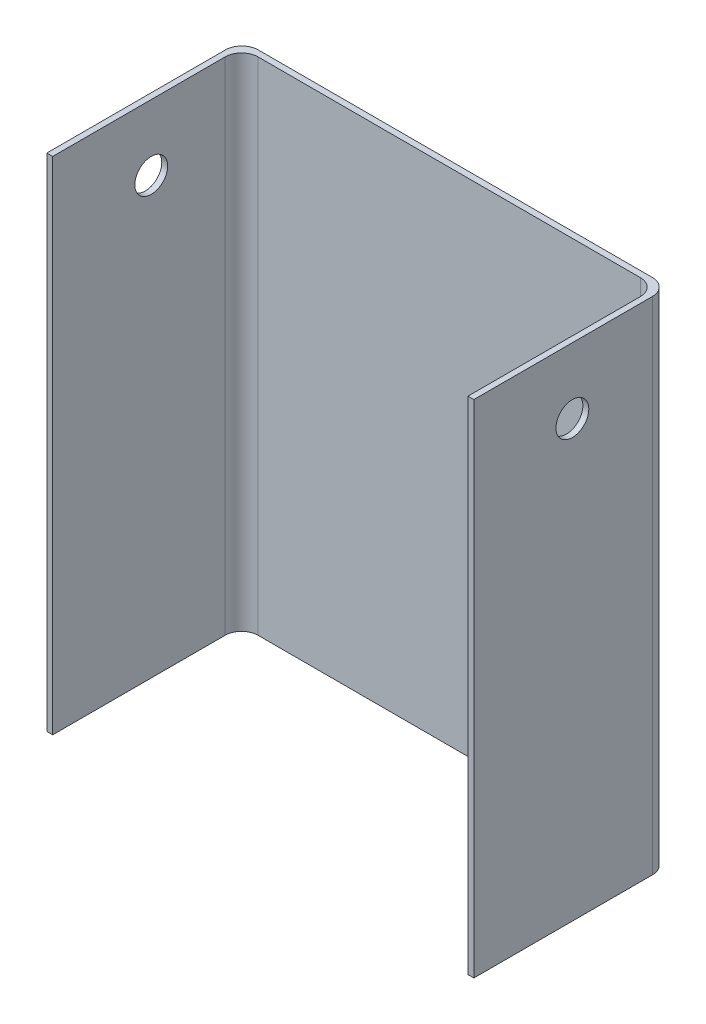
ISO-10303-21;
HEADER;
FILE_DESCRIPTION(('STEP AP214'),'2;1');
FILE_NAME('part.step','',(''),(''),'','','');
FILE_SCHEMA(('AUTOMOTIVE_DESIGN { 1 0 10303 214 1 1 1 1 }'));
ENDSEC;
DATA;
#1=APPLICATION_CONTEXT('core data for automotive mechanical design processes');
#2=APPLICATION_PROTOCOL_DEFINITION('international standard','automotive_design',2000,#1);
#3=PRODUCT_CONTEXT('',#1,'mechanical');
#4=PRODUCT('Part','Part','',(#3));
#5=PRODUCT_RELATED_PRODUCT_CATEGORY('part','',(#4));
#6=PRODUCT_DEFINITION_FORMATION('','',#4);
#7=PRODUCT_DEFINITION_CONTEXT('part definition',#1,'design');
#8=PRODUCT_DEFINITION('design','',#6,#7);
#9=PRODUCT_DEFINITION_SHAPE('','',#8);
#10=(LENGTH_UNIT() NAMED_UNIT(*) SI_UNIT(.MILLI.,.METRE.));
#11=(NAMED_UNIT(*) PLANE_ANGLE_UNIT() SI_UNIT($,.RADIAN.));
#12=(NAMED_UNIT(*) SI_UNIT($,.STERADIAN.) SOLID_ANGLE_UNIT());
#13=UNCERTAINTY_MEASURE_WITH_UNIT(LENGTH_MEASURE(1.E-05),#10,'distance_accuracy_value','');
#14=(GEOMETRIC_REPRESENTATION_CONTEXT(3) GLOBAL_UNCERTAINTY_ASSIGNED_CONTEXT((#13)) GLOBAL_UNIT_ASSIGNED_CONTEXT((#10,
#11,#12)) REPRESENTATION_CONTEXT('',''));
#15=CARTESIAN_POINT('',(0.,0.,0.));
#16=DIRECTION('',(0.,0.,1.));
#17=DIRECTION('',(1.,0.,0.));
#18=AXIS2_PLACEMENT_3D('',#15,#16,#17);
#19=CARTESIAN_POINT('',(0.,0.,30.1625));
#20=DIRECTION('',(0.,0.,1.));
#21=DIRECTION('',(1.,0.,0.));
#22=AXIS2_PLACEMENT_3D('',#19,#20,#21);
#23=PLANE('',#22);
#24=DIRECTION('',(0.,-1.,0.));
#25=VECTOR('',#24,1.);
#26=CARTESIAN_POINT('',(22.6183534310785,59.1559838274936,30.1625));
#27=LINE('',#26,#25);
#28=CARTESIAN_POINT('',(22.6183534310785,59.1559838274936,30.1625));
#29=VERTEX_POINT('',#28);
#30=CARTESIAN_POINT('',(22.6183534310785,-18.3140161725064,30.1625));
#31=VERTEX_POINT('',#30);
#32=EDGE_CURVE('E145',#29,#31,#27,.T.);
#33=ORIENTED_EDGE('',*,*,#32,.F.);
#34=DIRECTION('',(-1.,0.,0.));
#35=VECTOR('',#34,1.);
#36=CARTESIAN_POINT('',(21.7064934310785,59.1559838274936,30.1625));
#37=LINE('',#36,#35);
#38=CARTESIAN_POINT('',(21.7064934310785,59.1559838274936,30.1625));
#39=VERTEX_POINT('',#38);
#40=EDGE_CURVE('E165',#29,#39,#37,.T.);
#41=ORIENTED_EDGE('',*,*,#40,.T.);
#42=DIRECTION('',(0.,-1.,0.));
#43=VECTOR('',#42,1.);
#44=CARTESIAN_POINT('',(21.7064934310785,59.1559838274936,30.1625));
#45=LINE('',#44,#43);
#46=CARTESIAN_POINT('',(21.7064934310785,-18.3140161725064,30.1625));
#47=VERTEX_POINT('',#46);
#48=EDGE_CURVE('E156',#39,#47,#45,.T.);
#49=ORIENTED_EDGE('',*,*,#48,.T.);
#50=DIRECTION('',(1.,0.,0.));
#51=VECTOR('',#50,1.);
#52=CARTESIAN_POINT('',(21.7064934310785,-18.3140161725064,30.1625));
#53=LINE('',#52,#51);
#54=EDGE_CURVE('E134',#47,#31,#53,.T.);
#55=ORIENTED_EDGE('',*,*,#54,.T.);
#56=EDGE_LOOP('',(#33,#41,#49,#55));
#57=FACE_BOUND('',#56,.T.);
#58=ADVANCED_FACE('F40',(#57),#23,.T.);
#59=CARTESIAN_POINT('',(21.7064934310785,59.1559838274936,30.1625));
#60=DIRECTION('',(1.,0.,0.));
#61=DIRECTION('',(0.,1.,0.));
#62=AXIS2_PLACEMENT_3D('',#59,#60,#61);
#63=PLANE('',#62);
#64=CARTESIAN_POINT('',(21.7064934310785,48.9959838274936,14.9225));
#65=DIRECTION('',(-1.,0.,0.));
#66=DIRECTION('',(0.,-1.,0.));
#67=AXIS2_PLACEMENT_3D('',#64,#65,#66);
#68=CIRCLE('',#67,2.54);
#69=CARTESIAN_POINT('',(21.7064934310785,46.4559838274936,14.9225));
#70=VERTEX_POINT('',#69);
#71=EDGE_CURVE('E312',#70,#70,#68,.T.);
#72=ORIENTED_EDGE('',*,*,#71,.F.);
#73=EDGE_LOOP('',(#72));
#74=FACE_BOUND('',#73,.T.);
#75=DIRECTION('',(0.,0.,-1.));
#76=VECTOR('',#75,1.);
#77=CARTESIAN_POINT('',(21.7064934310785,59.1559838274936,30.1625));
#78=LINE('',#77,#76);
#79=CARTESIAN_POINT('',(21.7064934310785,59.1559838274936,2.54000000000001));
#80=VERTEX_POINT('',#79);
#81=EDGE_CURVE('E173',#39,#80,#78,.T.);
#82=ORIENTED_EDGE('',*,*,#81,.T.);
#83=DIRECTION('',(0.,-1.,0.));
#84=VECTOR('',#83,1.);
#85=CARTESIAN_POINT('',(21.7064934310785,59.1559838274936,2.54));
#86=LINE('',#85,#84);
#87=CARTESIAN_POINT('',(21.7064934310785,-18.3140161725064,2.54000000000001));
#88=VERTEX_POINT('',#87);
#89=EDGE_CURVE('E194',#80,#88,#86,.T.);
#90=ORIENTED_EDGE('',*,*,#89,.T.);
#91=DIRECTION('',(0.,0.,-1.));
#92=VECTOR('',#91,1.);
#93=CARTESIAN_POINT('',(21.7064934310785,-18.3140161725064,30.1625));
#94=LINE('',#93,#92);
#95=EDGE_CURVE('E191',#47,#88,#94,.T.);
#96=ORIENTED_EDGE('',*,*,#95,.F.);
#97=ORIENTED_EDGE('',*,*,#48,.F.);
#98=EDGE_LOOP('',(#82,#90,#96,#97));
#99=FACE_BOUND('',#98,.T.);
#100=ADVANCED_FACE('F270',(#74,#99),#63,.F.);
#101=CARTESIAN_POINT('',(21.7064934310785,-18.3140161725064,30.1625));
#102=DIRECTION('',(0.,1.,0.));
#103=DIRECTION('',(0.,0.,1.));
#104=AXIS2_PLACEMENT_3D('',#101,#102,#103);
#105=PLANE('',#104);
#106=DIRECTION('',(1.,0.,0.));
#107=VECTOR('',#106,1.);
#108=CARTESIAN_POINT('',(21.7064934310785,-18.3140161725064,0.));
#109=LINE('',#108,#107);
#110=CARTESIAN_POINT('',(24.2464934310785,-18.3140161725064,0.));
#111=VERTEX_POINT('',#110);
#112=CARTESIAN_POINT('',(85.2064934310785,-18.3140161725064,0.));
#113=VERTEX_POINT('',#112);
#114=EDGE_CURVE('E174',#111,#113,#109,.T.);
#115=ORIENTED_EDGE('',*,*,#114,.T.);
#116=CARTESIAN_POINT('',(85.2064934310785,-18.3140161725064,2.54));
#117=DIRECTION('',(0.,1.,0.));
#118=DIRECTION('',(0.,0.,1.));
#119=AXIS2_PLACEMENT_3D('',#116,#117,#118);
#120=CIRCLE('',#119,2.54);
#121=CARTESIAN_POINT('',(87.7464934310785,-18.3140161725064,2.54000000000001));
#122=VERTEX_POINT('',#121);
#123=EDGE_CURVE('E218',#113,#122,#120,.F.);
#124=ORIENTED_EDGE('',*,*,#123,.T.);
#125=DIRECTION('',(0.,0.,-1.));
#126=VECTOR('',#125,1.);
#127=CARTESIAN_POINT('',(87.7464934310785,-18.3140161725064,30.1625));
#128=LINE('',#127,#126);
#129=CARTESIAN_POINT('',(87.7464934310785,-18.3140161725064,30.1625));
#130=VERTEX_POINT('',#129);
#131=EDGE_CURVE('E187',#130,#122,#128,.T.);
#132=ORIENTED_EDGE('',*,*,#131,.F.);
#133=CARTESIAN_POINT('',(86.8346334310785,-18.3140161725064,30.1625));
#134=VERTEX_POINT('',#133);
#135=EDGE_CURVE('E160',#134,#130,#53,.T.);
#136=ORIENTED_EDGE('',*,*,#135,.F.);
#137=DIRECTION('',(0.,0.,1.));
#138=VECTOR('',#137,1.);
#139=CARTESIAN_POINT('',(86.8346334310785,-18.3140161725064,0.952500000000002));
#140=LINE('',#139,#138);
#141=CARTESIAN_POINT('',(86.8346334310785,-18.3140161725064,3.4925));
#142=VERTEX_POINT('',#141);
#143=EDGE_CURVE('E141',#142,#134,#140,.T.);
#144=ORIENTED_EDGE('',*,*,#143,.F.);
#145=CARTESIAN_POINT('',(84.2946334310785,-18.3140161725064,3.4925));
#146=DIRECTION('',(0.,1.,0.));
#147=DIRECTION('',(0.,0.,1.));
#148=AXIS2_PLACEMENT_3D('',#145,#146,#147);
#149=CIRCLE('',#148,2.54);
#150=CARTESIAN_POINT('',(84.2946334310785,-18.3140161725064,0.952500000000002));
#151=VERTEX_POINT('',#150);
#152=EDGE_CURVE('E11',#142,#151,#149,.T.);
#153=ORIENTED_EDGE('',*,*,#152,.T.);
#154=DIRECTION('',(1.,0.,0.));
#155=VECTOR('',#154,1.);
#156=CARTESIAN_POINT('',(22.6183534310785,-18.3140161725064,0.952500000000002));
#157=LINE('',#156,#155);
#158=CARTESIAN_POINT('',(25.1583534310785,-18.3140161725064,0.952500000000002));
#159=VERTEX_POINT('',#158);
#160=EDGE_CURVE('E290',#159,#151,#157,.T.);
#161=ORIENTED_EDGE('',*,*,#160,.F.);
#162=CARTESIAN_POINT('',(25.1583534310785,-18.3140161725064,3.4925));
#163=DIRECTION('',(0.,1.,0.));
#164=DIRECTION('',(0.,0.,1.));
#165=AXIS2_PLACEMENT_3D('',#162,#163,#164);
#166=CIRCLE('',#165,2.54);
#167=CARTESIAN_POINT('',(22.6183534310785,-18.3140161725064,3.4925));
#168=VERTEX_POINT('',#167);
#169=EDGE_CURVE('E137',#159,#168,#166,.T.);
#170=ORIENTED_EDGE('',*,*,#169,.T.);
#171=DIRECTION('',(0.,0.,1.));
#172=VECTOR('',#171,1.);
#173=CARTESIAN_POINT('',(22.6183534310785,-18.3140161725064,0.952500000000002));
#174=LINE('',#173,#172);
#175=EDGE_CURVE('E128',#168,#31,#174,.T.);
#176=ORIENTED_EDGE('',*,*,#175,.T.);
#177=ORIENTED_EDGE('',*,*,#54,.F.);
#178=ORIENTED_EDGE('',*,*,#95,.T.);
#179=CARTESIAN_POINT('',(24.2464934310785,-18.3140161725064,2.54));
#180=DIRECTION('',(0.,1.,0.));
#181=DIRECTION('',(0.,0.,1.));
#182=AXIS2_PLACEMENT_3D('',#179,#180,#181);
#183=CIRCLE('',#182,2.54);
#184=EDGE_CURVE('E198',#88,#111,#183,.F.);
#185=ORIENTED_EDGE('',*,*,#184,.T.);
#186=EDGE_LOOP('',(#115,#124,#132,#136,#144,#153,#161,#170,#176,#177,#178,#185));
#187=FACE_BOUND('',#186,.T.);
#188=ADVANCED_FACE('F131',(#187),#105,.F.);
#189=CARTESIAN_POINT('',(87.7464934310785,59.1559838274936,30.1625));
#190=DIRECTION('',(-1.,0.,0.));
#191=DIRECTION('',(0.,-1.,0.));
#192=AXIS2_PLACEMENT_3D('',#189,#190,#191);
#193=PLANE('',#192);
#194=CARTESIAN_POINT('',(87.7464934310785,48.9959838274936,14.9225));
#195=DIRECTION('',(-1.,0.,0.));
#196=DIRECTION('',(0.,-1.,0.));
#197=AXIS2_PLACEMENT_3D('',#194,#195,#196);
#198=CIRCLE('',#197,2.54);
#199=CARTESIAN_POINT('',(87.7464934310785,46.4559838274936,14.9225));
#200=VERTEX_POINT('',#199);
#201=EDGE_CURVE('E308',#200,#200,#198,.T.);
#202=ORIENTED_EDGE('',*,*,#201,.T.);
#203=EDGE_LOOP('',(#202));
#204=FACE_BOUND('',#203,.T.);
#205=ORIENTED_EDGE('',*,*,#131,.T.);
#206=DIRECTION('',(0.,1.,0.));
#207=VECTOR('',#206,1.);
#208=CARTESIAN_POINT('',(87.7464934310785,59.1559838274936,2.54));
#209=LINE('',#208,#207);
#210=CARTESIAN_POINT('',(87.7464934310785,59.1559838274936,2.54000000000001));
#211=VERTEX_POINT('',#210);
#212=EDGE_CURVE('E208',#122,#211,#209,.T.);
#213=ORIENTED_EDGE('',*,*,#212,.T.);
#214=DIRECTION('',(0.,0.,-1.));
#215=VECTOR('',#214,1.);
#216=CARTESIAN_POINT('',(87.7464934310785,59.1559838274936,30.1625));
#217=LINE('',#216,#215);
#218=CARTESIAN_POINT('',(87.7464934310785,59.1559838274936,30.1625));
#219=VERTEX_POINT('',#218);
#220=EDGE_CURVE('E183',#219,#211,#217,.T.);
#221=ORIENTED_EDGE('',*,*,#220,.F.);
#222=DIRECTION('',(0.,1.,0.));
#223=VECTOR('',#222,1.);
#224=CARTESIAN_POINT('',(87.7464934310785,59.1559838274936,30.1625));
#225=LINE('',#224,#223);
#226=EDGE_CURVE('E159',#130,#219,#225,.T.);
#227=ORIENTED_EDGE('',*,*,#226,.F.);
#228=EDGE_LOOP('',(#205,#213,#221,#227));
#229=FACE_BOUND('',#228,.T.);
#230=ADVANCED_FACE('F328',(#204,#229),#193,.F.);
#231=CARTESIAN_POINT('',(21.7064934310785,59.1559838274936,30.1625));
#232=DIRECTION('',(0.,-1.,0.));
#233=DIRECTION('',(0.,0.,-1.));
#234=AXIS2_PLACEMENT_3D('',#231,#232,#233);
#235=PLANE('',#234);
#236=ORIENTED_EDGE('',*,*,#220,.T.);
#237=CARTESIAN_POINT('',(85.2064934310785,59.1559838274936,2.54));
#238=DIRECTION('',(0.,-1.,0.));
#239=DIRECTION('',(0.,0.,-1.));
#240=AXIS2_PLACEMENT_3D('',#237,#238,#239);
#241=CIRCLE('',#240,2.54);
#242=CARTESIAN_POINT('',(85.2064934310785,59.1559838274936,0.));
#243=VERTEX_POINT('',#242);
#244=EDGE_CURVE('E212',#211,#243,#241,.F.);
#245=ORIENTED_EDGE('',*,*,#244,.T.);
#246=DIRECTION('',(-1.,0.,0.));
#247=VECTOR('',#246,1.);
#248=CARTESIAN_POINT('',(21.7064934310785,59.1559838274936,0.));
#249=LINE('',#248,#247);
#250=CARTESIAN_POINT('',(24.2464934310785,59.1559838274936,0.));
#251=VERTEX_POINT('',#250);
#252=EDGE_CURVE('E177',#243,#251,#249,.T.);
#253=ORIENTED_EDGE('',*,*,#252,.T.);
#254=CARTESIAN_POINT('',(24.2464934310785,59.1559838274936,2.54));
#255=DIRECTION('',(0.,-1.,0.));
#256=DIRECTION('',(0.,0.,-1.));
#257=AXIS2_PLACEMENT_3D('',#254,#255,#256);
#258=CIRCLE('',#257,2.54);
#259=EDGE_CURVE('E205',#251,#80,#258,.F.);
#260=ORIENTED_EDGE('',*,*,#259,.T.);
#261=ORIENTED_EDGE('',*,*,#81,.F.);
#262=ORIENTED_EDGE('',*,*,#40,.F.);
#263=DIRECTION('',(0.,0.,1.));
#264=VECTOR('',#263,1.);
#265=CARTESIAN_POINT('',(22.6183534310785,59.1559838274936,0.952500000000002));
#266=LINE('',#265,#264);
#267=CARTESIAN_POINT('',(22.6183534310785,59.1559838274936,3.4925));
#268=VERTEX_POINT('',#267);
#269=EDGE_CURVE('E148',#268,#29,#266,.T.);
#270=ORIENTED_EDGE('',*,*,#269,.F.);
#271=CARTESIAN_POINT('',(25.1583534310785,59.1559838274936,3.4925));
#272=DIRECTION('',(0.,-1.,0.));
#273=DIRECTION('',(0.,0.,-1.));
#274=AXIS2_PLACEMENT_3D('',#271,#272,#273);
#275=CIRCLE('',#274,2.54);
#276=CARTESIAN_POINT('',(25.1583534310785,59.1559838274936,0.952500000000002));
#277=VERTEX_POINT('',#276);
#278=EDGE_CURVE('E230',#268,#277,#275,.T.);
#279=ORIENTED_EDGE('',*,*,#278,.T.);
#280=DIRECTION('',(-1.,0.,0.));
#281=VECTOR('',#280,1.);
#282=CARTESIAN_POINT('',(22.6183534310785,59.1559838274936,0.952500000000002));
#283=LINE('',#282,#281);
#284=CARTESIAN_POINT('',(84.2946334310785,59.1559838274936,0.952500000000002));
#285=VERTEX_POINT('',#284);
#286=EDGE_CURVE('E142',#285,#277,#283,.T.);
#287=ORIENTED_EDGE('',*,*,#286,.F.);
#288=CARTESIAN_POINT('',(84.2946334310785,59.1559838274936,3.4925));
#289=DIRECTION('',(0.,-1.,0.));
#290=DIRECTION('',(0.,0.,-1.));
#291=AXIS2_PLACEMENT_3D('',#288,#289,#290);
#292=CIRCLE('',#291,2.54);
#293=CARTESIAN_POINT('',(86.8346334310785,59.1559838274936,3.4925));
#294=VERTEX_POINT('',#293);
#295=EDGE_CURVE('E50',#285,#294,#292,.T.);
#296=ORIENTED_EDGE('',*,*,#295,.T.);
#297=DIRECTION('',(0.,0.,1.));
#298=VECTOR('',#297,1.);
#299=CARTESIAN_POINT('',(86.8346334310785,59.1559838274936,0.952500000000002));
#300=LINE('',#299,#298);
#301=CARTESIAN_POINT('',(86.8346334310785,59.1559838274936,30.1625));
#302=VERTEX_POINT('',#301);
#303=EDGE_CURVE('E279',#294,#302,#300,.T.);
#304=ORIENTED_EDGE('',*,*,#303,.T.);
#305=EDGE_CURVE('E169',#219,#302,#37,.T.);
#306=ORIENTED_EDGE('',*,*,#305,.F.);
#307=EDGE_LOOP('',(#236,#245,#253,#260,#261,#262,#270,#279,#287,#296,#304,#306));
#308=FACE_BOUND('',#307,.T.);
#309=ADVANCED_FACE('F266',(#308),#235,.F.);
#310=DIRECTION('',(0.,1.,0.));
#311=VECTOR('',#310,1.);
#312=CARTESIAN_POINT('',(86.8346334310785,59.1559838274936,30.1625));
#313=LINE('',#312,#311);
#314=EDGE_CURVE('E152',#134,#302,#313,.T.);
#315=ORIENTED_EDGE('',*,*,#314,.F.);
#316=ORIENTED_EDGE('',*,*,#135,.T.);
#317=ORIENTED_EDGE('',*,*,#226,.T.);
#318=ORIENTED_EDGE('',*,*,#305,.T.);
#319=EDGE_LOOP('',(#315,#316,#317,#318));
#320=FACE_BOUND('',#319,.T.);
#321=ADVANCED_FACE('F331',(#320),#23,.T.);
#322=CARTESIAN_POINT('',(0.,0.,0.));
#323=DIRECTION('',(0.,0.,1.));
#324=DIRECTION('',(1.,0.,0.));
#325=AXIS2_PLACEMENT_3D('',#322,#323,#324);
#326=PLANE('',#325);
#327=ORIENTED_EDGE('',*,*,#252,.F.);
#328=DIRECTION('',(0.,1.,0.));
#329=VECTOR('',#328,1.);
#330=CARTESIAN_POINT('',(85.2064934310785,0.,0.));
#331=LINE('',#330,#329);
#332=EDGE_CURVE('E215',#243,#113,#331,.F.);
#333=ORIENTED_EDGE('',*,*,#332,.T.);
#334=ORIENTED_EDGE('',*,*,#114,.F.);
#335=DIRECTION('',(0.,-1.,0.));
#336=VECTOR('',#335,1.);
#337=CARTESIAN_POINT('',(24.2464934310785,0.,0.));
#338=LINE('',#337,#336);
#339=EDGE_CURVE('E201',#111,#251,#338,.F.);
#340=ORIENTED_EDGE('',*,*,#339,.T.);
#341=EDGE_LOOP('',(#327,#333,#334,#340));
#342=FACE_BOUND('',#341,.T.);
#343=ADVANCED_FACE('F370',(#342),#326,.F.);
#344=CARTESIAN_POINT('',(22.6183534310785,59.1559838274936,0.952500000000002));
#345=DIRECTION('',(-1.,0.,0.));
#346=DIRECTION('',(0.,-1.,0.));
#347=AXIS2_PLACEMENT_3D('',#344,#345,#346);
#348=PLANE('',#347);
#349=CARTESIAN_POINT('',(22.6183534310785,48.9959838274936,14.9225));
#350=DIRECTION('',(-1.,0.,0.));
#351=DIRECTION('',(0.,-1.,0.));
#352=AXIS2_PLACEMENT_3D('',#349,#350,#351);
#353=CIRCLE('',#352,2.54);
#354=CARTESIAN_POINT('',(22.6183534310785,46.4559838274936,14.9225));
#355=VERTEX_POINT('',#354);
#356=EDGE_CURVE('E153',#355,#355,#353,.T.);
#357=ORIENTED_EDGE('',*,*,#356,.T.);
#358=EDGE_LOOP('',(#357));
#359=FACE_BOUND('',#358,.T.);
#360=ORIENTED_EDGE('',*,*,#175,.F.);
#361=DIRECTION('',(0.,-1.,0.));
#362=VECTOR('',#361,1.);
#363=CARTESIAN_POINT('',(22.6183534310785,59.1559838274936,3.4925));
#364=LINE('',#363,#362);
#365=EDGE_CURVE('E225',#168,#268,#364,.F.);
#366=ORIENTED_EDGE('',*,*,#365,.T.);
#367=ORIENTED_EDGE('',*,*,#269,.T.);
#368=ORIENTED_EDGE('',*,*,#32,.T.);
#369=EDGE_LOOP('',(#360,#366,#367,#368));
#370=FACE_BOUND('',#369,.T.);
#371=ADVANCED_FACE('F146',(#359,#370),#348,.F.);
#372=CARTESIAN_POINT('',(86.8346334310785,59.1559838274936,0.952500000000002));
#373=DIRECTION('',(1.,0.,0.));
#374=DIRECTION('',(0.,1.,0.));
#375=AXIS2_PLACEMENT_3D('',#372,#373,#374);
#376=PLANE('',#375);
#377=CARTESIAN_POINT('',(86.8346334310785,48.9959838274936,14.9225));
#378=DIRECTION('',(1.,0.,0.));
#379=DIRECTION('',(0.,1.,0.));
#380=AXIS2_PLACEMENT_3D('',#377,#378,#379);
#381=CIRCLE('',#380,2.54);
#382=CARTESIAN_POINT('',(86.8346334310785,51.5359838274936,14.9225));
#383=VERTEX_POINT('',#382);
#384=EDGE_CURVE('E44',#383,#383,#381,.T.);
#385=ORIENTED_EDGE('',*,*,#384,.T.);
#386=EDGE_LOOP('',(#385));
#387=FACE_BOUND('',#386,.T.);
#388=ORIENTED_EDGE('',*,*,#303,.F.);
#389=DIRECTION('',(0.,1.,0.));
#390=VECTOR('',#389,1.);
#391=CARTESIAN_POINT('',(86.8346334310785,59.1559838274936,3.4925));
#392=LINE('',#391,#390);
#393=EDGE_CURVE('E57',#294,#142,#392,.F.);
#394=ORIENTED_EDGE('',*,*,#393,.T.);
#395=ORIENTED_EDGE('',*,*,#143,.T.);
#396=ORIENTED_EDGE('',*,*,#314,.T.);
#397=EDGE_LOOP('',(#388,#394,#395,#396));
#398=FACE_BOUND('',#397,.T.);
#399=ADVANCED_FACE('F358',(#387,#398),#376,.F.);
#400=CARTESIAN_POINT('',(0.,0.,0.952500000000002));
#401=DIRECTION('',(0.,0.,1.));
#402=DIRECTION('',(1.,0.,0.));
#403=AXIS2_PLACEMENT_3D('',#400,#401,#402);
#404=PLANE('',#403);
#405=ORIENTED_EDGE('',*,*,#160,.T.);
#406=DIRECTION('',(0.,1.,0.));
#407=VECTOR('',#406,1.);
#408=CARTESIAN_POINT('',(84.2946334310785,0.,0.952500000000002));
#409=LINE('',#408,#407);
#410=EDGE_CURVE('E234',#151,#285,#409,.T.);
#411=ORIENTED_EDGE('',*,*,#410,.T.);
#412=ORIENTED_EDGE('',*,*,#286,.T.);
#413=DIRECTION('',(0.,-1.,0.));
#414=VECTOR('',#413,1.);
#415=CARTESIAN_POINT('',(25.1583534310785,0.,0.952500000000002));
#416=LINE('',#415,#414);
#417=EDGE_CURVE('E221',#277,#159,#416,.T.);
#418=ORIENTED_EDGE('',*,*,#417,.T.);
#419=EDGE_LOOP('',(#405,#411,#412,#418));
#420=FACE_BOUND('',#419,.T.);
#421=ADVANCED_FACE('F338',(#420),#404,.T.);
#422=CARTESIAN_POINT('',(24.2464934310785,59.1559838274936,2.54));
#423=DIRECTION('',(0.,-1.,0.));
#424=DIRECTION('',(1.,0.,0.));
#425=AXIS2_PLACEMENT_3D('',#422,#423,#424);
#426=CYLINDRICAL_SURFACE('',#425,2.54);
#427=ORIENTED_EDGE('',*,*,#259,.F.);
#428=ORIENTED_EDGE('',*,*,#339,.F.);
#429=ORIENTED_EDGE('',*,*,#184,.F.);
#430=ORIENTED_EDGE('',*,*,#89,.F.);
#431=EDGE_LOOP('',(#427,#428,#429,#430));
#432=FACE_BOUND('',#431,.T.);
#433=ADVANCED_FACE('F334',(#432),#426,.T.);
#434=CARTESIAN_POINT('',(85.2064934310785,59.1559838274936,2.54));
#435=DIRECTION('',(0.,1.,0.));
#436=DIRECTION('',(-1.,0.,0.));
#437=AXIS2_PLACEMENT_3D('',#434,#435,#436);
#438=CYLINDRICAL_SURFACE('',#437,2.54);
#439=ORIENTED_EDGE('',*,*,#123,.F.);
#440=ORIENTED_EDGE('',*,*,#332,.F.);
#441=ORIENTED_EDGE('',*,*,#244,.F.);
#442=ORIENTED_EDGE('',*,*,#212,.F.);
#443=EDGE_LOOP('',(#439,#440,#441,#442));
#444=FACE_BOUND('',#443,.T.);
#445=ADVANCED_FACE('F337',(#444),#438,.T.);
#446=CARTESIAN_POINT('',(25.1583534310785,0.,3.4925));
#447=DIRECTION('',(0.,-1.,0.));
#448=DIRECTION('',(1.,0.,0.));
#449=AXIS2_PLACEMENT_3D('',#446,#447,#448);
#450=CYLINDRICAL_SURFACE('',#449,2.54);
#451=ORIENTED_EDGE('',*,*,#278,.F.);
#452=ORIENTED_EDGE('',*,*,#365,.F.);
#453=ORIENTED_EDGE('',*,*,#169,.F.);
#454=ORIENTED_EDGE('',*,*,#417,.F.);
#455=EDGE_LOOP('',(#451,#452,#453,#454));
#456=FACE_BOUND('',#455,.T.);
#457=ADVANCED_FACE('F341',(#456),#450,.F.);
#458=CARTESIAN_POINT('',(84.2946334310785,0.,3.4925));
#459=DIRECTION('',(0.,1.,0.));
#460=DIRECTION('',(-1.,0.,0.));
#461=AXIS2_PLACEMENT_3D('',#458,#459,#460);
#462=CYLINDRICAL_SURFACE('',#461,2.54);
#463=ORIENTED_EDGE('',*,*,#152,.F.);
#464=ORIENTED_EDGE('',*,*,#393,.F.);
#465=ORIENTED_EDGE('',*,*,#295,.F.);
#466=ORIENTED_EDGE('',*,*,#410,.F.);
#467=EDGE_LOOP('',(#463,#464,#465,#466));
#468=FACE_BOUND('',#467,.T.);
#469=ADVANCED_FACE('F42',(#468),#462,.F.);
#470=CARTESIAN_POINT('',(87.7464934310785,48.9959838274936,14.9225));
#471=DIRECTION('',(-1.,0.,0.));
#472=DIRECTION('',(0.,-1.,0.));
#473=AXIS2_PLACEMENT_3D('',#470,#471,#472);
#474=CYLINDRICAL_SURFACE('',#473,2.54);
#475=ORIENTED_EDGE('',*,*,#201,.F.);
#476=EDGE_LOOP('',(#475));
#477=FACE_BOUND('',#476,.T.);
#478=ORIENTED_EDGE('',*,*,#384,.F.);
#479=EDGE_LOOP('',(#478));
#480=FACE_BOUND('',#479,.T.);
#481=ADVANCED_FACE('F348',(#477,#480),#474,.F.);
#482=ORIENTED_EDGE('',*,*,#71,.T.);
#483=EDGE_LOOP('',(#482));
#484=FACE_BOUND('',#483,.T.);
#485=ORIENTED_EDGE('',*,*,#356,.F.);
#486=EDGE_LOOP('',(#485));
#487=FACE_BOUND('',#486,.T.);
#488=ADVANCED_FACE('F319',(#484,#487),#474,.F.);
#489=CLOSED_SHELL('',(#58,#100,#188,#230,#309,#321,#343,#371,#399,#421,#433,#445,#457,#469,#481,#488));
#490=MANIFOLD_SOLID_BREP('B2',#489);
#491=ADVANCED_BREP_SHAPE_REPRESENTATION('',(#18,#490),#14);
#492=SHAPE_DEFINITION_REPRESENTATION(#9,#491);
ENDSEC;
END-ISO-10303-21;
